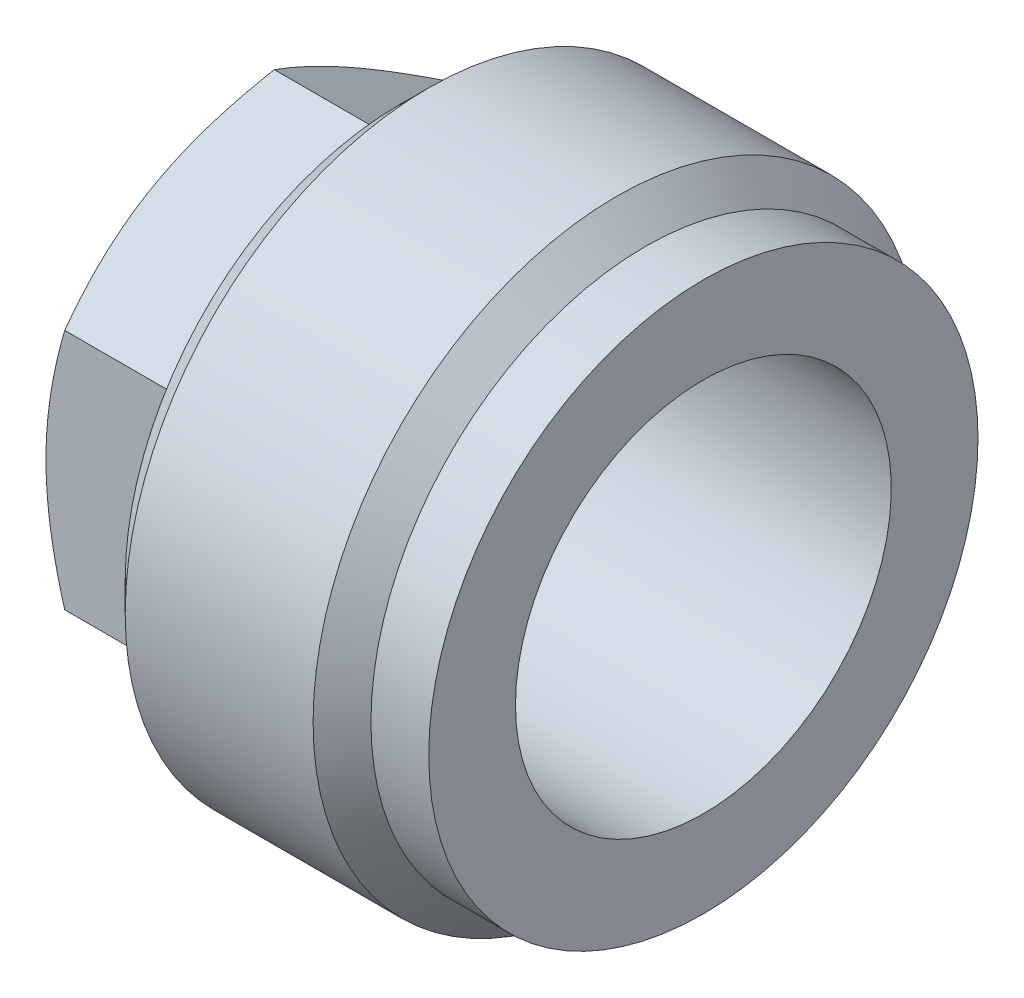
ISO-10303-21;
HEADER;
FILE_DESCRIPTION(('STEP AP214'),'2;1');
FILE_NAME('part.step','',(''),(''),'','','');
FILE_SCHEMA(('AUTOMOTIVE_DESIGN { 1 0 10303 214 1 1 1 1 }'));
ENDSEC;
DATA;
#1=APPLICATION_CONTEXT('core data for automotive mechanical design processes');
#2=APPLICATION_PROTOCOL_DEFINITION('international standard','automotive_design',2000,#1);
#3=PRODUCT_CONTEXT('',#1,'mechanical');
#4=PRODUCT('Part','Part','',(#3));
#5=PRODUCT_RELATED_PRODUCT_CATEGORY('part','',(#4));
#6=PRODUCT_DEFINITION_FORMATION('','',#4);
#7=PRODUCT_DEFINITION_CONTEXT('part definition',#1,'design');
#8=PRODUCT_DEFINITION('design','',#6,#7);
#9=PRODUCT_DEFINITION_SHAPE('','',#8);
#10=(LENGTH_UNIT() NAMED_UNIT(*) SI_UNIT(.MILLI.,.METRE.));
#11=(NAMED_UNIT(*) PLANE_ANGLE_UNIT() SI_UNIT($,.RADIAN.));
#12=(NAMED_UNIT(*) SI_UNIT($,.STERADIAN.) SOLID_ANGLE_UNIT());
#13=UNCERTAINTY_MEASURE_WITH_UNIT(LENGTH_MEASURE(1.E-05),#10,'distance_accuracy_value','');
#14=(GEOMETRIC_REPRESENTATION_CONTEXT(3) GLOBAL_UNCERTAINTY_ASSIGNED_CONTEXT((#13)) GLOBAL_UNIT_ASSIGNED_CONTEXT((#10,
#11,#12)) REPRESENTATION_CONTEXT('',''));
#15=CARTESIAN_POINT('',(0.,0.,0.));
#16=DIRECTION('',(0.,0.,1.));
#17=DIRECTION('',(1.,0.,0.));
#18=AXIS2_PLACEMENT_3D('',#15,#16,#17);
#19=CARTESIAN_POINT('',(0.,0.,0.));
#20=DIRECTION('',(1.,0.,0.));
#21=DIRECTION('',(0.,0.,-1.));
#22=AXIS2_PLACEMENT_3D('',#19,#20,#21);
#23=CONICAL_SURFACE('',#22,11.,1.0471975511966);
#24=CARTESIAN_POINT('',(0.,0.,0.));
#25=DIRECTION('',(-1.,0.,0.));
#26=DIRECTION('',(0.,0.,1.));
#27=AXIS2_PLACEMENT_3D('',#24,#25,#26);
#28=CIRCLE('',#27,11.);
#29=CARTESIAN_POINT('',(0.,0.,11.));
#30=VERTEX_POINT('',#29);
#31=EDGE_CURVE('E154',#30,#30,#28,.T.);
#32=ORIENTED_EDGE('',*,*,#31,.F.);
#33=EDGE_LOOP('',(#32));
#34=FACE_BOUND('',#33,.T.);
#35=CARTESIAN_POINT('',(8.85369715088494,-21.9837447292834,14.5));
#36=CARTESIAN_POINT('',(8.70204605875602,-21.6690801795933,14.5));
#37=CARTESIAN_POINT('',(8.55119048299628,-21.3540324231774,14.5));
#38=CARTESIAN_POINT('',(8.25125165099913,-20.7230903107022,14.5));
#39=CARTESIAN_POINT('',(8.10216841437291,-20.4071959453224,14.5));
#40=CARTESIAN_POINT('',(7.65780642841271,-19.4580311551152,14.5));
#41=CARTESIAN_POINT('',(7.36546439149564,-18.8233803892831,14.5));
#42=CARTESIAN_POINT('',(6.7887953399051,-17.5459566901159,14.5));
#43=CARTESIAN_POINT('',(6.50452533749712,-16.9031579542143,14.5));
#44=CARTESIAN_POINT('',(5.94831045484284,-15.6122677175618,14.5));
#45=CARTESIAN_POINT('',(5.67636495460579,-14.9641764849929,14.5));
#46=CARTESIAN_POINT('',(5.14049299184127,-13.6429681660332,14.5));
#47=CARTESIAN_POINT('',(4.87701981018571,-12.969666219259,14.5));
#48=CARTESIAN_POINT('',(4.37126035874995,-11.614997053229,14.5));
#49=CARTESIAN_POINT('',(4.12897653384384,-10.933628913549,14.5));
#50=CARTESIAN_POINT('',(3.6723298206573,-9.56321324763013,14.5));
#51=CARTESIAN_POINT('',(3.45790577193684,-8.87418627538426,14.5));
#52=CARTESIAN_POINT('',(3.06417774424848,-7.48620007270868,14.5));
#53=CARTESIAN_POINT('',(2.8848621581599,-6.78724420709032,14.5));
#54=CARTESIAN_POINT('',(2.64941908092588,-5.73314426646876,14.5));
#55=CARTESIAN_POINT('',(2.57666197092174,-5.38168833373473,14.5));
#56=CARTESIAN_POINT('',(2.44324478792689,-4.67647591473801,14.5));
#57=CARTESIAN_POINT('',(2.38258443658456,-4.32271948160428,14.5));
#58=CARTESIAN_POINT('',(2.27446033353613,-3.61319111402284,14.5));
#59=CARTESIAN_POINT('',(2.22699637527553,-3.25741921121091,14.5));
#60=CARTESIAN_POINT('',(2.1462255803631,-2.54426038157059,14.5));
#61=CARTESIAN_POINT('',(2.11291874632254,-2.18687345444432,14.5));
#62=CARTESIAN_POINT('',(2.06151782603693,-1.47544495728037,14.5));
#63=CARTESIAN_POINT('',(2.043240643502,-1.12141669565865,14.5));
#64=CARTESIAN_POINT('',(2.02162880295409,-0.412906860774309,14.5));
#65=CARTESIAN_POINT('',(2.0182939128042,-0.0584252946396092,14.5));
#66=CARTESIAN_POINT('',(2.02664555712274,0.650367577323326,14.5));
#67=CARTESIAN_POINT('',(2.03833234577728,1.004678880169,14.5));
#68=CARTESIAN_POINT('',(2.07645298909111,1.71251353163224,14.5));
#69=CARTESIAN_POINT('',(2.10288766893028,2.066036835048,14.5));
#70=CARTESIAN_POINT('',(2.18510492148384,2.93138207762086,14.5));
#71=CARTESIAN_POINT('',(2.24875406224798,3.44246851329039,14.5));
#72=CARTESIAN_POINT('',(2.40328217915786,4.46051202165636,14.5));
#73=CARTESIAN_POINT('',(2.49416529743642,4.96746845414635,14.5));
#74=CARTESIAN_POINT('',(2.69992739077851,5.97688278490651,14.5));
#75=CARTESIAN_POINT('',(2.8148263641863,6.47933656779497,14.5));
#76=CARTESIAN_POINT('',(3.06514729389721,7.47904614892213,14.5));
#77=CARTESIAN_POINT('',(3.20056881048709,7.97630205828581,14.5));
#78=CARTESIAN_POINT('',(3.49185520948424,8.97648287054239,14.5));
#79=CARTESIAN_POINT('',(3.64810024974023,9.47929630380537,14.5));
#80=CARTESIAN_POINT('',(3.97564768679148,10.4799678031127,14.5));
#81=CARTESIAN_POINT('',(4.14695018250332,10.9778258365798,14.5));
#82=CARTESIAN_POINT('',(4.50198849081267,11.9688530975369,14.5));
#83=CARTESIAN_POINT('',(4.68571951678699,12.4620240476497,14.5));
#84=CARTESIAN_POINT('',(5.0635604800101,13.4443517353121,14.5));
#85=CARTESIAN_POINT('',(5.25767030727211,13.9335085153375,14.5));
#86=CARTESIAN_POINT('',(5.72034900769401,15.0699643747976,14.5));
#87=CARTESIAN_POINT('',(5.99225937766753,15.7159008867475,14.5));
#88=CARTESIAN_POINT('',(6.54818005280653,17.0025603545441,14.5));
#89=CARTESIAN_POINT('',(6.83219099844285,17.6432830322851,14.5));
#90=CARTESIAN_POINT('',(7.40992297902714,18.920473508036,14.5));
#91=CARTESIAN_POINT('',(7.70364587439248,19.5569404624185,14.5));
#92=CARTESIAN_POINT('',(8.29887627851228,20.8262011707074,14.5));
#93=CARTESIAN_POINT('',(8.60038364451664,21.4589949917109,14.5));
#94=CARTESIAN_POINT('',(9.21004884791101,22.7221296195771,14.5));
#95=CARTESIAN_POINT('',(9.51821290615491,23.3524674190409,14.5));
#96=CARTESIAN_POINT('',(10.1397846011221,24.6105518575379,14.5));
#97=CARTESIAN_POINT('',(10.453192257243,25.2382984869749,14.5));
#98=CARTESIAN_POINT('',(11.0843315876181,26.4915242956458,14.5));
#99=CARTESIAN_POINT('',(11.4020627752816,27.1170037201702,14.5));
#100=CARTESIAN_POINT('',(12.041187755865,28.3660894797944,14.5));
#101=CARTESIAN_POINT('',(12.3625815617134,28.9896958082726,14.5));
#102=CARTESIAN_POINT('',(13.2792445163674,30.7575455749468,14.5));
#103=CARTESIAN_POINT('',(13.8781859068375,31.8998848960828,14.5));
#104=CARTESIAN_POINT('',(15.0838911182563,34.180463380899,14.5));
#105=CARTESIAN_POINT('',(15.690655179214,35.3187024174003,14.5));
#106=CARTESIAN_POINT('',(16.9088417254602,37.5894379626514,14.5));
#107=CARTESIAN_POINT('',(17.520250919918,38.7219416062141,14.5));
#108=CARTESIAN_POINT('',(18.4408708831463,40.4187570296067,14.5));
#109=CARTESIAN_POINT('',(18.7483211735969,40.9840253389499,14.5));
#110=CARTESIAN_POINT('',(19.3642743233957,42.1139871893487,14.5));
#111=CARTESIAN_POINT('',(19.6727771812338,42.6786807312276,14.5));
#112=CARTESIAN_POINT('',(19.9817462970959,43.2431191182595,14.5));
#113=B_SPLINE_CURVE_WITH_KNOTS('',3,(#35,#36,#37,#38,#39,#40,#41,#42,#43,#44,#45,#46,#47,#48,
#49,#50,#51,#52,#53,#54,#55,#56,#57,#58,#59,#60,#61,#62,#63,#64,#65,#66,#67,#68,#69,#70,#71,#72,
#73,#74,#75,#76,#77,#78,#79,#80,#81,#82,#83,#84,#85,#86,#87,#88,#89,#90,#91,#92,#93,#94,#95,#96,
#97,#98,#99,#100,#101,#102,#103,#104,#105,#106,#107,#108,#109,#110,#111,#112),.UNSPECIFIED.,.F.,
.F.,(4,2,2,2,2,2,2,2,2,2,2,2,2,2,2,2,2,2,2,2,2,2,2,2,2,2,2,2,2,2,2,2,2,2,2,2,2,2,4),(0.,
1.04790369237559,2.09581896918192,4.19198721607569,6.30043998476489,8.40878656859536,
10.5775655470282,12.7465944346624,14.9107781767023,17.0742452107258,18.1507942557225,
19.2273185260036,20.3038259452064,21.3803335629698,22.4435239504337,23.5066978205804,
24.569889681232,25.633141035985,27.1773789435955,28.7218518403067,30.2676160022407,
31.8133470495226,33.3926528806091,34.971969087366,36.5506804745136,38.1293751349744,
40.2317128244983,42.334161927134,44.4370161343548,46.5398318071955,48.6447057963304,
50.7495875737661,52.8542343856394,54.9588886289201,58.8283427169832,62.6979158084008,
66.5589201658682,68.4893300408467,70.4197371474434),.UNSPECIFIED.);
#114=CARTESIAN_POINT('',(3.3158137055808,-8.37157890324959,14.5));
#115=VERTEX_POINT('',#114);
#116=CARTESIAN_POINT('',(3.3158137055808,8.37157890324958,14.5));
#117=VERTEX_POINT('',#116);
#118=EDGE_CURVE('E157',#115,#117,#113,.T.);
#119=ORIENTED_EDGE('',*,*,#118,.T.);
#120=CARTESIAN_POINT('',(3.31588037293711,8.37146343319575,14.5002));
#121=CARTESIAN_POINT('',(3.20965246927558,8.55546747944839,14.1814956430922));
#122=CARTESIAN_POINT('',(3.10824498134964,8.74018924037394,13.8615481679055));
#123=CARTESIAN_POINT('',(2.91641074841678,9.11111401384652,13.2190876144651));
#124=CARTESIAN_POINT('',(2.82598761494956,9.29731749224125,12.8965737293393));
#125=CARTESIAN_POINT('',(2.65733756284704,9.67156556109036,12.2483570594581));
#126=CARTESIAN_POINT('',(2.57913950076179,9.85961342647729,11.9226486023531));
#127=CARTESIAN_POINT('',(2.43661873257904,10.2370158634131,11.26896840668));
#128=CARTESIAN_POINT('',(2.37229523490865,10.4263703597795,10.9409967983317));
#129=CARTESIAN_POINT('',(2.2602594955058,10.8015340722416,10.2911941871912));
#130=CARTESIAN_POINT('',(2.21217643566121,10.9873154357964,9.96941142641481));
#131=CARTESIAN_POINT('',(2.13155175339208,11.3597294504657,9.32437143155702));
#132=CARTESIAN_POINT('',(2.099010430111,11.546362117896,9.00111416921565));
#133=CARTESIAN_POINT('',(2.05029087069972,11.9199409708332,8.35405661529508));
#134=CARTESIAN_POINT('',(2.03409319014358,12.1068865181052,8.03025742917119));
#135=CARTESIAN_POINT('',(2.01840925926922,12.4809501828225,7.38236015661536));
#136=CARTESIAN_POINT('',(2.01892249258619,12.668068294757,7.05826207972854));
#137=CARTESIAN_POINT('',(2.03549312870936,13.0178844607384,6.45236270693979));
#138=CARTESIAN_POINT('',(2.04952931252634,13.180607443739,6.17051823282346));
#139=CARTESIAN_POINT('',(2.08997489243088,13.5056791091891,5.60747759216301));
#140=CARTESIAN_POINT('',(2.11638516371189,13.6680277643466,5.32628147288959));
#141=CARTESIAN_POINT('',(2.18111843864144,13.9922625918472,4.76469027807526));
#142=CARTESIAN_POINT('',(2.21945128117973,14.1541482703664,4.48429605786223));
#143=CARTESIAN_POINT('',(2.30735715707971,14.477160677042,3.92482215802512));
#144=CARTESIAN_POINT('',(2.35693095457372,14.6382873528427,3.64574256908353));
#145=CARTESIAN_POINT('',(2.52376693841917,15.1273963273992,2.79858097471386));
#146=CARTESIAN_POINT('',(2.6576644054764,15.4539622471642,2.23295220966028));
#147=CARTESIAN_POINT('',(2.96155687700353,16.1022245928325,1.11012889032907));
#148=CARTESIAN_POINT('',(3.13148051136534,16.4239293186526,0.552919960173676));
#149=CARTESIAN_POINT('',(3.31588037293711,16.743273276553,-0.00020000000000039));
#150=B_SPLINE_CURVE_WITH_KNOTS('',3,(#120,#121,#122,#123,#124,#125,#126,#127,#128,#129,#130,
#131,#132,#133,#134,#135,#136,#137,#138,#139,#140,#141,#142,#143,#144,#145,#146,#147,#148,#149),
.UNSPECIFIED.,.F.,.F.,(4,2,2,2,2,2,2,2,2,2,2,2,2,2,4),(0.,1.1491292412427,2.29863528726014,
3.45081498778683,4.60292893665856,5.72660597685857,6.85030464444022,7.9726648386707,
9.09499035216778,10.0720003417185,11.0490794435848,12.0269670115884,13.0049210739102,
15.0038354445183,16.9988262362696),.UNSPECIFIED.);
#151=CARTESIAN_POINT('',(3.3158137055808,16.7431578064992,0.));
#152=VERTEX_POINT('',#151);
#153=EDGE_CURVE('E204',#117,#152,#150,.T.);
#154=ORIENTED_EDGE('',*,*,#153,.T.);
#155=CARTESIAN_POINT('',(3.31588037293711,16.743273276553,0.000199999999997968));
#156=CARTESIAN_POINT('',(3.20965246927559,16.5592692303004,-0.318504356907842));
#157=CARTESIAN_POINT('',(3.10824498134965,16.3745474693748,-0.63845183209447));
#158=CARTESIAN_POINT('',(2.91641074841679,16.0036226959022,-1.28091238553496));
#159=CARTESIAN_POINT('',(2.82598761494956,15.8174192175075,-1.60342627066068));
#160=CARTESIAN_POINT('',(2.65733756284705,15.4431711486584,-2.25164294054187));
#161=CARTESIAN_POINT('',(2.5791395007618,15.2551232832715,-2.57735139764692));
#162=CARTESIAN_POINT('',(2.43661873257904,14.8777208463357,-3.23103159332003));
#163=CARTESIAN_POINT('',(2.37229523490866,14.6883663499693,-3.55900320166828));
#164=CARTESIAN_POINT('',(2.26025949550581,14.3132026375071,-4.20880581280883));
#165=CARTESIAN_POINT('',(2.21217643566121,14.1274212739523,-4.5305885735852));
#166=CARTESIAN_POINT('',(2.13155175339209,13.7550072592831,-5.175628568443));
#167=CARTESIAN_POINT('',(2.099010430111,13.5683745918528,-5.49888583078436));
#168=CARTESIAN_POINT('',(2.05029087069972,13.1947957389156,-6.14594338470494));
#169=CARTESIAN_POINT('',(2.03409319014359,13.0078501916436,-6.46974257082883));
#170=CARTESIAN_POINT('',(2.01840925926922,12.6337865269262,-7.11763984338466));
#171=CARTESIAN_POINT('',(2.01892249258618,12.4466684149918,-7.44173792027148));
#172=CARTESIAN_POINT('',(2.03549312870935,12.0968522490104,-8.04763729306023));
#173=CARTESIAN_POINT('',(2.04952931252634,11.9341292660097,-8.32948176717656));
#174=CARTESIAN_POINT('',(2.08997489243089,11.6090576005597,-8.89252240783701));
#175=CARTESIAN_POINT('',(2.11638516371189,11.4467089454021,-9.17371852711043));
#176=CARTESIAN_POINT('',(2.18111843864144,11.1224741179015,-9.73530972192476));
#177=CARTESIAN_POINT('',(2.21945128117973,10.9605884393823,-10.0157039421378));
#178=CARTESIAN_POINT('',(2.30735715707971,10.6375760327068,-10.5751778419749));
#179=CARTESIAN_POINT('',(2.35693095457372,10.476449356906,-10.8542574309165));
#180=CARTESIAN_POINT('',(2.52376693841918,9.98734038234961,-11.7014190252862));
#181=CARTESIAN_POINT('',(2.6576644054764,9.66077446258452,-12.2670477903397));
#182=CARTESIAN_POINT('',(2.96155687700353,9.01251211691626,-13.3898711096709));
#183=CARTESIAN_POINT('',(3.13148051136535,8.69080739109618,-13.9470800398263));
#184=CARTESIAN_POINT('',(3.31588037293712,8.37146343319575,-14.5002));
#185=B_SPLINE_CURVE_WITH_KNOTS('',3,(#155,#156,#157,#158,#159,#160,#161,#162,#163,#164,#165,
#166,#167,#168,#169,#170,#171,#172,#173,#174,#175,#176,#177,#178,#179,#180,#181,#182,#183,#184),
.UNSPECIFIED.,.F.,.F.,(4,2,2,2,2,2,2,2,2,2,2,2,2,2,4),(0.,1.1491292412427,2.29863528726014,
3.45081498778683,4.60292893665856,5.72660597685857,6.85030464444022,7.9726648386707,
9.09499035216778,10.0720003417185,11.0490794435847,12.0269670115884,13.0049210739102,
15.0038354445183,16.9988262362696),.UNSPECIFIED.);
#186=CARTESIAN_POINT('',(3.3158137055808,8.37157890324959,-14.5));
#187=VERTEX_POINT('',#186);
#188=EDGE_CURVE('E72',#152,#187,#185,.T.);
#189=ORIENTED_EDGE('',*,*,#188,.T.);
#190=CARTESIAN_POINT('',(8.85369715088494,-21.9837447292834,-14.5));
#191=CARTESIAN_POINT('',(8.70204605875601,-21.6690801795933,-14.5));
#192=CARTESIAN_POINT('',(8.55119048299627,-21.3540324231774,-14.5));
#193=CARTESIAN_POINT('',(8.25125165099912,-20.7230903107022,-14.5));
#194=CARTESIAN_POINT('',(8.10216841437291,-20.4071959453224,-14.5));
#195=CARTESIAN_POINT('',(7.65780642841271,-19.4580311551152,-14.5));
#196=CARTESIAN_POINT('',(7.36546439149563,-18.8233803892831,-14.5));
#197=CARTESIAN_POINT('',(6.78879533990509,-17.5459566901159,-14.5));
#198=CARTESIAN_POINT('',(6.50452533749712,-16.9031579542143,-14.5));
#199=CARTESIAN_POINT('',(5.94831045484284,-15.6122677175618,-14.5));
#200=CARTESIAN_POINT('',(5.67636495460579,-14.9641764849929,-14.5));
#201=CARTESIAN_POINT('',(5.14049299184126,-13.6429681660332,-14.5));
#202=CARTESIAN_POINT('',(4.87701981018571,-12.969666219259,-14.5));
#203=CARTESIAN_POINT('',(4.37126035874995,-11.614997053229,-14.5));
#204=CARTESIAN_POINT('',(4.12897653384384,-10.933628913549,-14.5));
#205=CARTESIAN_POINT('',(3.67232982065729,-9.56321324763011,-14.5));
#206=CARTESIAN_POINT('',(3.45790577193684,-8.87418627538425,-14.5));
#207=CARTESIAN_POINT('',(3.06417774424848,-7.48620007270867,-14.5));
#208=CARTESIAN_POINT('',(2.88486215815991,-6.78724420709031,-14.5));
#209=CARTESIAN_POINT('',(2.64941908092588,-5.73314426646875,-14.5));
#210=CARTESIAN_POINT('',(2.57666197092174,-5.38168833373472,-14.5));
#211=CARTESIAN_POINT('',(2.44324478792689,-4.676475914738,-14.5));
#212=CARTESIAN_POINT('',(2.38258443658456,-4.32271948160427,-14.5));
#213=CARTESIAN_POINT('',(2.27446033353613,-3.61319111402283,-14.5));
#214=CARTESIAN_POINT('',(2.22699637527553,-3.2574192112109,-14.5));
#215=CARTESIAN_POINT('',(2.1462255803631,-2.54426038157058,-14.5));
#216=CARTESIAN_POINT('',(2.11291874632255,-2.1868734544443,-14.5));
#217=CARTESIAN_POINT('',(2.06151782603693,-1.47544495728036,-14.5));
#218=CARTESIAN_POINT('',(2.043240643502,-1.12141669565864,-14.5));
#219=CARTESIAN_POINT('',(2.02162880295409,-0.412906860774294,-14.5));
#220=CARTESIAN_POINT('',(2.0182939128042,-0.0584252946395943,-14.5));
#221=CARTESIAN_POINT('',(2.02664555712275,0.65036757732334,-14.5));
#222=CARTESIAN_POINT('',(2.03833234577728,1.00467888016901,-14.5));
#223=CARTESIAN_POINT('',(2.07645298909111,1.71251353163225,-14.5));
#224=CARTESIAN_POINT('',(2.10288766893028,2.06603683504801,-14.5));
#225=CARTESIAN_POINT('',(2.18510492148384,2.93138207762088,-14.5));
#226=CARTESIAN_POINT('',(2.24875406224799,3.4424685132904,-14.5));
#227=CARTESIAN_POINT('',(2.40328217915787,4.46051202165637,-14.5));
#228=CARTESIAN_POINT('',(2.49416529743643,4.96746845414636,-14.5));
#229=CARTESIAN_POINT('',(2.69992739077851,5.97688278490652,-14.5));
#230=CARTESIAN_POINT('',(2.81482636418631,6.47933656779498,-14.5));
#231=CARTESIAN_POINT('',(3.06514729389722,7.47904614892214,-14.5));
#232=CARTESIAN_POINT('',(3.2005688104871,7.97630205828582,-14.5));
#233=CARTESIAN_POINT('',(3.49185520948425,8.97648287054241,-14.5));
#234=CARTESIAN_POINT('',(3.64810024974024,9.47929630380539,-14.5));
#235=CARTESIAN_POINT('',(3.97564768679149,10.4799678031128,-14.5));
#236=CARTESIAN_POINT('',(4.14695018250334,10.9778258365798,-14.5));
#237=CARTESIAN_POINT('',(4.50198849081268,11.9688530975369,-14.5));
#238=CARTESIAN_POINT('',(4.685719516787,12.4620240476497,-14.5));
#239=CARTESIAN_POINT('',(5.06356048001011,13.4443517353121,-14.5));
#240=CARTESIAN_POINT('',(5.25767030727212,13.9335085153375,-14.5));
#241=CARTESIAN_POINT('',(5.72034900769403,15.0699643747977,-14.5));
#242=CARTESIAN_POINT('',(5.99225937766755,15.7159008867475,-14.5));
#243=CARTESIAN_POINT('',(6.54818005280655,17.0025603545441,-14.5));
#244=CARTESIAN_POINT('',(6.83219099844287,17.6432830322851,-14.5));
#245=CARTESIAN_POINT('',(7.40992297902716,18.9204735080361,-14.5));
#246=CARTESIAN_POINT('',(7.70364587439249,19.5569404624185,-14.5));
#247=CARTESIAN_POINT('',(8.2988762785123,20.8262011707075,-14.5));
#248=CARTESIAN_POINT('',(8.60038364451666,21.4589949917109,-14.5));
#249=CARTESIAN_POINT('',(9.21004884791103,22.7221296195772,-14.5));
#250=CARTESIAN_POINT('',(9.51821290615493,23.3524674190409,-14.5));
#251=CARTESIAN_POINT('',(10.1397846011221,24.6105518575379,-14.5));
#252=CARTESIAN_POINT('',(10.453192257243,25.2382984869749,-14.5));
#253=CARTESIAN_POINT('',(11.0843315876181,26.4915242956458,-14.5));
#254=CARTESIAN_POINT('',(11.4020627752816,27.1170037201702,-14.5));
#255=CARTESIAN_POINT('',(12.041187755865,28.3660894797944,-14.5));
#256=CARTESIAN_POINT('',(12.3625815617134,28.9896958082726,-14.5));
#257=CARTESIAN_POINT('',(13.2792445163674,30.7575455749468,-14.5));
#258=CARTESIAN_POINT('',(13.8781859068375,31.8998848960828,-14.5));
#259=CARTESIAN_POINT('',(15.0838911182563,34.1804633808991,-14.5));
#260=CARTESIAN_POINT('',(15.690655179214,35.3187024174004,-14.5));
#261=CARTESIAN_POINT('',(16.9088417254603,37.5894379626515,-14.5));
#262=CARTESIAN_POINT('',(17.520250919918,38.7219416062142,-14.5));
#263=CARTESIAN_POINT('',(18.4408708831463,40.4187570296068,-14.5));
#264=CARTESIAN_POINT('',(18.7483211735969,40.9840253389499,-14.5));
#265=CARTESIAN_POINT('',(19.3642743233957,42.1139871893487,-14.5));
#266=CARTESIAN_POINT('',(19.6727771812338,42.6786807312276,-14.5));
#267=CARTESIAN_POINT('',(19.9817462970959,43.2431191182595,-14.5));
#268=B_SPLINE_CURVE_WITH_KNOTS('',3,(#190,#191,#192,#193,#194,#195,#196,#197,#198,#199,#200,
#201,#202,#203,#204,#205,#206,#207,#208,#209,#210,#211,#212,#213,#214,#215,#216,#217,#218,#219,
#220,#221,#222,#223,#224,#225,#226,#227,#228,#229,#230,#231,#232,#233,#234,#235,#236,#237,#238,
#239,#240,#241,#242,#243,#244,#245,#246,#247,#248,#249,#250,#251,#252,#253,#254,#255,#256,#257,
#258,#259,#260,#261,#262,#263,#264,#265,#266,#267),.UNSPECIFIED.,.F.,.F.,(4,2,2,2,2,2,2,2,2,2,2,
2,2,2,2,2,2,2,2,2,2,2,2,2,2,2,2,2,2,2,2,2,2,2,2,2,2,2,4),(0.,1.04790369237559,2.09581896918192,
4.19198721607568,6.30043998476488,8.40878656859535,10.5775655470282,12.7465944346624,
14.9107781767023,17.0742452107258,18.1507942557225,19.2273185260036,20.3038259452064,
21.3803335629698,22.4435239504337,23.5066978205804,24.569889681232,25.633141035985,
27.1773789435955,28.7218518403067,30.2676160022407,31.8133470495226,33.3926528806091,
34.971969087366,36.5506804745136,38.1293751349744,40.2317128244983,42.334161927134,
44.4370161343549,46.5398318071956,48.6447057963305,50.7495875737661,52.8542343856394,
54.9588886289201,58.8283427169832,62.6979158084008,66.5589201658683,68.4893300408467,
70.4197371474434),.UNSPECIFIED.);
#269=CARTESIAN_POINT('',(3.3158137055808,-8.37157890324958,-14.5));
#270=VERTEX_POINT('',#269);
#271=EDGE_CURVE('E117',#187,#270,#268,.F.);
#272=ORIENTED_EDGE('',*,*,#271,.T.);
#273=CARTESIAN_POINT('',(3.31588037293712,-8.37146343319574,-14.5002));
#274=CARTESIAN_POINT('',(3.20965246927559,-8.55546747944839,-14.1814956430922));
#275=CARTESIAN_POINT('',(3.10824498134964,-8.74018924037393,-13.8615481679056));
#276=CARTESIAN_POINT('',(2.91641074841678,-9.11111401384652,-13.2190876144651));
#277=CARTESIAN_POINT('',(2.82598761494956,-9.29731749224124,-12.8965737293393));
#278=CARTESIAN_POINT('',(2.65733756284705,-9.67156556109035,-12.2483570594581));
#279=CARTESIAN_POINT('',(2.5791395007618,-9.85961342647729,-11.9226486023531));
#280=CARTESIAN_POINT('',(2.43661873257904,-10.2370158634131,-11.26896840668));
#281=CARTESIAN_POINT('',(2.37229523490865,-10.4263703597795,-10.9409967983317));
#282=CARTESIAN_POINT('',(2.26025949550581,-10.8015340722416,-10.2911941871912));
#283=CARTESIAN_POINT('',(2.21217643566121,-10.9873154357964,-9.96941142641482));
#284=CARTESIAN_POINT('',(2.13155175339209,-11.3597294504657,-9.32437143155702));
#285=CARTESIAN_POINT('',(2.099010430111,-11.546362117896,-9.00111416921566));
#286=CARTESIAN_POINT('',(2.05029087069972,-11.9199409708332,-8.35405661529509));
#287=CARTESIAN_POINT('',(2.03409319014359,-12.1068865181052,-8.0302574291712));
#288=CARTESIAN_POINT('',(2.01840925926922,-12.4809501828225,-7.38236015661537));
#289=CARTESIAN_POINT('',(2.01892249258618,-12.668068294757,-7.05826207972854));
#290=CARTESIAN_POINT('',(2.03549312870935,-13.0178844607384,-6.4523627069398));
#291=CARTESIAN_POINT('',(2.04952931252633,-13.180607443739,-6.17051823282346));
#292=CARTESIAN_POINT('',(2.08997489243088,-13.5056791091891,-5.60747759216301));
#293=CARTESIAN_POINT('',(2.11638516371189,-13.6680277643466,-5.32628147288959));
#294=CARTESIAN_POINT('',(2.18111843864144,-13.9922625918472,-4.76469027807526));
#295=CARTESIAN_POINT('',(2.21945128117973,-14.1541482703664,-4.48429605786224));
#296=CARTESIAN_POINT('',(2.30735715707971,-14.477160677042,-3.92482215802513));
#297=CARTESIAN_POINT('',(2.35693095457372,-14.6382873528427,-3.64574256908353));
#298=CARTESIAN_POINT('',(2.52376693841917,-15.1273963273992,-2.79858097471387));
#299=CARTESIAN_POINT('',(2.6576644054764,-15.4539622471642,-2.23295220966028));
#300=CARTESIAN_POINT('',(2.96155687700353,-16.1022245928325,-1.11012889032908));
#301=CARTESIAN_POINT('',(3.13148051136535,-16.4239293186526,-0.552919960173681));
#302=CARTESIAN_POINT('',(3.31588037293711,-16.743273276553,0.000199999999998351));
#303=B_SPLINE_CURVE_WITH_KNOTS('',3,(#273,#274,#275,#276,#277,#278,#279,#280,#281,#282,#283,
#284,#285,#286,#287,#288,#289,#290,#291,#292,#293,#294,#295,#296,#297,#298,#299,#300,#301,#302),
.UNSPECIFIED.,.F.,.F.,(4,2,2,2,2,2,2,2,2,2,2,2,2,2,4),(0.,1.1491292412427,2.29863528726014,
3.45081498778683,4.60292893665856,5.72660597685857,6.85030464444022,7.9726648386707,
9.09499035216778,10.0720003417185,11.0490794435848,12.0269670115884,13.0049210739102,
15.0038354445184,16.9988262362696),.UNSPECIFIED.);
#304=CARTESIAN_POINT('',(3.3158137055808,-16.7431578064992,0.));
#305=VERTEX_POINT('',#304);
#306=EDGE_CURVE('E190',#270,#305,#303,.T.);
#307=ORIENTED_EDGE('',*,*,#306,.T.);
#308=CARTESIAN_POINT('',(3.31588037293711,-16.743273276553,-0.000200000000002602));
#309=CARTESIAN_POINT('',(3.20965246927559,-16.5592692303004,0.318504356907838));
#310=CARTESIAN_POINT('',(3.10824498134965,-16.3745474693748,0.638451832094467));
#311=CARTESIAN_POINT('',(2.91641074841679,-16.0036226959022,1.28091238553496));
#312=CARTESIAN_POINT('',(2.82598761494956,-15.8174192175075,1.60342627066068));
#313=CARTESIAN_POINT('',(2.65733756284705,-15.4431711486584,2.25164294054187));
#314=CARTESIAN_POINT('',(2.5791395007618,-15.2551232832715,2.57735139764691));
#315=CARTESIAN_POINT('',(2.43661873257904,-14.8777208463357,3.23103159332003));
#316=CARTESIAN_POINT('',(2.37229523490866,-14.6883663499693,3.55900320166827));
#317=CARTESIAN_POINT('',(2.26025949550581,-14.3132026375071,4.20880581280882));
#318=CARTESIAN_POINT('',(2.21217643566121,-14.1274212739523,4.5305885735852));
#319=CARTESIAN_POINT('',(2.13155175339209,-13.7550072592831,5.175628568443));
#320=CARTESIAN_POINT('',(2.099010430111,-13.5683745918528,5.49888583078436));
#321=CARTESIAN_POINT('',(2.05029087069972,-13.1947957389156,6.14594338470493));
#322=CARTESIAN_POINT('',(2.03409319014359,-13.0078501916436,6.46974257082882));
#323=CARTESIAN_POINT('',(2.01840925926922,-12.6337865269262,7.11763984338466));
#324=CARTESIAN_POINT('',(2.01892249258618,-12.4466684149918,7.44173792027148));
#325=CARTESIAN_POINT('',(2.03549312870935,-12.0968522490104,8.04763729306022));
#326=CARTESIAN_POINT('',(2.04952931252634,-11.9341292660097,8.32948176717655));
#327=CARTESIAN_POINT('',(2.08997489243089,-11.6090576005597,8.89252240783701));
#328=CARTESIAN_POINT('',(2.11638516371189,-11.4467089454021,9.17371852711043));
#329=CARTESIAN_POINT('',(2.18111843864144,-11.1224741179015,9.73530972192476));
#330=CARTESIAN_POINT('',(2.21945128117973,-10.9605884393823,10.0157039421378));
#331=CARTESIAN_POINT('',(2.30735715707971,-10.6375760327068,10.5751778419749));
#332=CARTESIAN_POINT('',(2.35693095457372,-10.476449356906,10.8542574309165));
#333=CARTESIAN_POINT('',(2.52376693841918,-9.98734038234961,11.7014190252862));
#334=CARTESIAN_POINT('',(2.6576644054764,-9.66077446258453,12.2670477903397));
#335=CARTESIAN_POINT('',(2.96155687700353,-9.01251211691626,13.3898711096709));
#336=CARTESIAN_POINT('',(3.13148051136535,-8.69080739109618,13.9470800398263));
#337=CARTESIAN_POINT('',(3.31588037293712,-8.37146343319576,14.5002));
#338=B_SPLINE_CURVE_WITH_KNOTS('',3,(#308,#309,#310,#311,#312,#313,#314,#315,#316,#317,#318,
#319,#320,#321,#322,#323,#324,#325,#326,#327,#328,#329,#330,#331,#332,#333,#334,#335,#336,#337),
.UNSPECIFIED.,.F.,.F.,(4,2,2,2,2,2,2,2,2,2,2,2,2,2,4),(0.,1.1491292412427,2.29863528726014,
3.45081498778683,4.60292893665856,5.72660597685857,6.85030464444022,7.97266483867069,
9.09499035216778,10.0720003417185,11.0490794435847,12.0269670115884,13.0049210739102,
15.0038354445183,16.9988262362696),.UNSPECIFIED.);
#339=EDGE_CURVE('E165',#305,#115,#338,.T.);
#340=ORIENTED_EDGE('',*,*,#339,.T.);
#341=EDGE_LOOP('',(#119,#154,#189,#272,#307,#340));
#342=FACE_BOUND('',#341,.T.);
#343=ADVANCED_FACE('F49',(#34,#342),#23,.T.);
#344=CARTESIAN_POINT('',(0.,0.,0.));
#345=DIRECTION('',(-1.,0.,0.));
#346=DIRECTION('',(0.,0.,1.));
#347=AXIS2_PLACEMENT_3D('',#344,#345,#346);
#348=CYLINDRICAL_SURFACE('',#347,9.188);
#349=CARTESIAN_POINT('',(1.60000000000001,0.,0.));
#350=DIRECTION('',(-1.,0.,0.));
#351=DIRECTION('',(0.,0.,1.));
#352=AXIS2_PLACEMENT_3D('',#349,#350,#351);
#353=CIRCLE('',#352,9.188);
#354=CARTESIAN_POINT('',(1.60000000000001,0.,9.18800000000001));
#355=VERTEX_POINT('',#354);
#356=EDGE_CURVE('E57',#355,#355,#353,.T.);
#357=ORIENTED_EDGE('',*,*,#356,.T.);
#358=EDGE_LOOP('',(#357));
#359=FACE_BOUND('',#358,.T.);
#360=CARTESIAN_POINT('',(13.,0.,0.));
#361=DIRECTION('',(-1.,0.,0.));
#362=DIRECTION('',(0.,0.,1.));
#363=AXIS2_PLACEMENT_3D('',#360,#361,#362);
#364=CIRCLE('',#363,9.188);
#365=CARTESIAN_POINT('',(13.,0.,9.18800000000001));
#366=VERTEX_POINT('',#365);
#367=EDGE_CURVE('E136',#366,#366,#364,.T.);
#368=ORIENTED_EDGE('',*,*,#367,.F.);
#369=EDGE_LOOP('',(#368));
#370=FACE_BOUND('',#369,.T.);
#371=ADVANCED_FACE('F246',(#359,#370),#348,.F.);
#372=CARTESIAN_POINT('',(0.,-9.18800000000001,0.));
#373=DIRECTION('',(-1.,0.,0.));
#374=DIRECTION('',(0.,0.,1.));
#375=AXIS2_PLACEMENT_3D('',#372,#373,#374);
#376=PLANE('',#375);
#377=CARTESIAN_POINT('',(0.,0.,0.));
#378=DIRECTION('',(-1.,0.,0.));
#379=DIRECTION('',(0.,0.,1.));
#380=AXIS2_PLACEMENT_3D('',#377,#378,#379);
#381=CIRCLE('',#380,10.788);
#382=CARTESIAN_POINT('',(0.,0.,10.788));
#383=VERTEX_POINT('',#382);
#384=EDGE_CURVE('E13',#383,#383,#381,.F.);
#385=ORIENTED_EDGE('',*,*,#384,.T.);
#386=EDGE_LOOP('',(#385));
#387=FACE_BOUND('',#386,.T.);
#388=ORIENTED_EDGE('',*,*,#31,.T.);
#389=EDGE_LOOP('',(#388));
#390=FACE_BOUND('',#389,.T.);
#391=ADVANCED_FACE('F241',(#387,#390),#376,.T.);
#392=CARTESIAN_POINT('',(12.,-17.5,0.));
#393=DIRECTION('',(-1.,0.,0.));
#394=DIRECTION('',(0.,0.,1.));
#395=AXIS2_PLACEMENT_3D('',#392,#393,#394);
#396=PLANE('',#395);
#397=CARTESIAN_POINT('',(12.,0.,0.));
#398=DIRECTION('',(-1.,0.,0.));
#399=DIRECTION('',(0.,0.,1.));
#400=AXIS2_PLACEMENT_3D('',#397,#398,#399);
#401=CIRCLE('',#400,19.);
#402=CARTESIAN_POINT('',(12.,0.,19.));
#403=VERTEX_POINT('',#402);
#404=EDGE_CURVE('E269',#403,#403,#401,.T.);
#405=ORIENTED_EDGE('',*,*,#404,.T.);
#406=EDGE_LOOP('',(#405));
#407=FACE_BOUND('',#406,.T.);
#408=DIRECTION('',(0.,0.5,0.86602540378444));
#409=VECTOR('',#408,1.);
#410=CARTESIAN_POINT('',(12.,12.5573683548744,-7.25000000000001));
#411=LINE('',#410,#409);
#412=CARTESIAN_POINT('',(12.,8.37157890324959,-14.5));
#413=VERTEX_POINT('',#412);
#414=CARTESIAN_POINT('',(12.,16.7431578064992,0.));
#415=VERTEX_POINT('',#414);
#416=EDGE_CURVE('E102',#413,#415,#411,.T.);
#417=ORIENTED_EDGE('',*,*,#416,.T.);
#418=DIRECTION('',(0.,-0.500000000000001,0.86602540378444));
#419=VECTOR('',#418,1.);
#420=CARTESIAN_POINT('',(12.,12.5573683548744,7.25000000000001));
#421=LINE('',#420,#419);
#422=CARTESIAN_POINT('',(12.,8.37157890324958,14.5));
#423=VERTEX_POINT('',#422);
#424=EDGE_CURVE('E268',#415,#423,#421,.T.);
#425=ORIENTED_EDGE('',*,*,#424,.T.);
#426=DIRECTION('',(0.,-1.,0.));
#427=VECTOR('',#426,1.);
#428=CARTESIAN_POINT('',(12.,0.,14.5));
#429=LINE('',#428,#427);
#430=CARTESIAN_POINT('',(12.,-8.37157890324959,14.5));
#431=VERTEX_POINT('',#430);
#432=EDGE_CURVE('E132',#423,#431,#429,.T.);
#433=ORIENTED_EDGE('',*,*,#432,.T.);
#434=DIRECTION('',(0.,-0.5,-0.86602540378444));
#435=VECTOR('',#434,1.);
#436=CARTESIAN_POINT('',(12.,-12.5573683548744,7.25000000000001));
#437=LINE('',#436,#435);
#438=CARTESIAN_POINT('',(12.,-16.7431578064992,0.));
#439=VERTEX_POINT('',#438);
#440=EDGE_CURVE('E129',#431,#439,#437,.T.);
#441=ORIENTED_EDGE('',*,*,#440,.T.);
#442=DIRECTION('',(0.,0.500000000000001,-0.866025403784439));
#443=VECTOR('',#442,1.);
#444=CARTESIAN_POINT('',(12.,-12.5573683548744,-7.25000000000001));
#445=LINE('',#444,#443);
#446=CARTESIAN_POINT('',(12.,-8.37157890324958,-14.5));
#447=VERTEX_POINT('',#446);
#448=EDGE_CURVE('E118',#439,#447,#445,.T.);
#449=ORIENTED_EDGE('',*,*,#448,.T.);
#450=DIRECTION('',(0.,1.,0.));
#451=VECTOR('',#450,1.);
#452=CARTESIAN_POINT('',(12.,0.,-14.5));
#453=LINE('',#452,#451);
#454=EDGE_CURVE('E114',#447,#413,#453,.T.);
#455=ORIENTED_EDGE('',*,*,#454,.T.);
#456=EDGE_LOOP('',(#417,#425,#433,#441,#449,#455));
#457=FACE_BOUND('',#456,.T.);
#458=ADVANCED_FACE('F121',(#407,#457),#396,.T.);
#459=CARTESIAN_POINT('',(0.,0.,0.));
#460=DIRECTION('',(-1.,0.,0.));
#461=DIRECTION('',(0.,0.,1.));
#462=AXIS2_PLACEMENT_3D('',#459,#460,#461);
#463=CYLINDRICAL_SURFACE('',#462,21.);
#464=CARTESIAN_POINT('',(14.,0.,0.));
#465=DIRECTION('',(-1.,0.,0.));
#466=DIRECTION('',(0.,0.,1.));
#467=AXIS2_PLACEMENT_3D('',#464,#465,#466);
#468=CIRCLE('',#467,21.);
#469=CARTESIAN_POINT('',(14.,0.,21.));
#470=VERTEX_POINT('',#469);
#471=EDGE_CURVE('E270',#470,#470,#468,.F.);
#472=ORIENTED_EDGE('',*,*,#471,.T.);
#473=EDGE_LOOP('',(#472));
#474=FACE_BOUND('',#473,.T.);
#475=CARTESIAN_POINT('',(27.,0.,0.));
#476=DIRECTION('',(-1.,0.,0.));
#477=DIRECTION('',(0.,0.,1.));
#478=AXIS2_PLACEMENT_3D('',#475,#476,#477);
#479=CIRCLE('',#478,21.);
#480=CARTESIAN_POINT('',(27.,0.,21.));
#481=VERTEX_POINT('',#480);
#482=EDGE_CURVE('E151',#481,#481,#479,.T.);
#483=ORIENTED_EDGE('',*,*,#482,.T.);
#484=EDGE_LOOP('',(#483));
#485=FACE_BOUND('',#484,.T.);
#486=ADVANCED_FACE('F236',(#474,#485),#463,.T.);
#487=CARTESIAN_POINT('',(27.,0.,0.));
#488=DIRECTION('',(-1.,0.,0.));
#489=DIRECTION('',(0.,0.,1.));
#490=AXIS2_PLACEMENT_3D('',#487,#488,#489);
#491=CONICAL_SURFACE('',#490,21.,0.78539816339745);
#492=CARTESIAN_POINT('',(29.,0.,0.));
#493=DIRECTION('',(-1.,0.,0.));
#494=DIRECTION('',(0.,0.,1.));
#495=AXIS2_PLACEMENT_3D('',#492,#493,#494);
#496=CIRCLE('',#495,19.);
#497=CARTESIAN_POINT('',(29.,0.,19.));
#498=VERTEX_POINT('',#497);
#499=EDGE_CURVE('E148',#498,#498,#496,.T.);
#500=ORIENTED_EDGE('',*,*,#499,.T.);
#501=EDGE_LOOP('',(#500));
#502=FACE_BOUND('',#501,.T.);
#503=ORIENTED_EDGE('',*,*,#482,.F.);
#504=EDGE_LOOP('',(#503));
#505=FACE_BOUND('',#504,.T.);
#506=ADVANCED_FACE('F232',(#502,#505),#491,.T.);
#507=CARTESIAN_POINT('',(0.,0.,0.));
#508=DIRECTION('',(-1.,0.,0.));
#509=DIRECTION('',(0.,0.,1.));
#510=AXIS2_PLACEMENT_3D('',#507,#508,#509);
#511=CYLINDRICAL_SURFACE('',#510,19.);
#512=CARTESIAN_POINT('',(33.,0.,0.));
#513=DIRECTION('',(-1.,0.,0.));
#514=DIRECTION('',(0.,0.,1.));
#515=AXIS2_PLACEMENT_3D('',#512,#513,#514);
#516=CIRCLE('',#515,19.);
#517=CARTESIAN_POINT('',(33.,0.,19.));
#518=VERTEX_POINT('',#517);
#519=EDGE_CURVE('E145',#518,#518,#516,.T.);
#520=ORIENTED_EDGE('',*,*,#519,.T.);
#521=EDGE_LOOP('',(#520));
#522=FACE_BOUND('',#521,.T.);
#523=ORIENTED_EDGE('',*,*,#499,.F.);
#524=EDGE_LOOP('',(#523));
#525=FACE_BOUND('',#524,.T.);
#526=ADVANCED_FACE('F228',(#522,#525),#511,.T.);
#527=CARTESIAN_POINT('',(33.,-19.,0.));
#528=DIRECTION('',(1.,0.,0.));
#529=DIRECTION('',(0.,0.,-1.));
#530=AXIS2_PLACEMENT_3D('',#527,#528,#529);
#531=PLANE('',#530);
#532=CARTESIAN_POINT('',(33.,0.,0.));
#533=DIRECTION('',(-1.,0.,0.));
#534=DIRECTION('',(0.,0.,1.));
#535=AXIS2_PLACEMENT_3D('',#532,#533,#534);
#536=CIRCLE('',#535,13.);
#537=CARTESIAN_POINT('',(33.,0.,13.));
#538=VERTEX_POINT('',#537);
#539=EDGE_CURVE('E142',#538,#538,#536,.T.);
#540=ORIENTED_EDGE('',*,*,#539,.T.);
#541=EDGE_LOOP('',(#540));
#542=FACE_BOUND('',#541,.T.);
#543=ORIENTED_EDGE('',*,*,#519,.F.);
#544=EDGE_LOOP('',(#543));
#545=FACE_BOUND('',#544,.T.);
#546=ADVANCED_FACE('F224',(#542,#545),#531,.T.);
#547=CARTESIAN_POINT('',(0.,0.,0.));
#548=DIRECTION('',(-1.,0.,0.));
#549=DIRECTION('',(0.,0.,1.));
#550=AXIS2_PLACEMENT_3D('',#547,#548,#549);
#551=CYLINDRICAL_SURFACE('',#550,13.);
#552=CARTESIAN_POINT('',(13.,0.,0.));
#553=DIRECTION('',(-1.,0.,0.));
#554=DIRECTION('',(0.,0.,1.));
#555=AXIS2_PLACEMENT_3D('',#552,#553,#554);
#556=CIRCLE('',#555,13.);
#557=CARTESIAN_POINT('',(13.,0.,13.));
#558=VERTEX_POINT('',#557);
#559=EDGE_CURVE('E139',#558,#558,#556,.T.);
#560=ORIENTED_EDGE('',*,*,#559,.T.);
#561=EDGE_LOOP('',(#560));
#562=FACE_BOUND('',#561,.T.);
#563=ORIENTED_EDGE('',*,*,#539,.F.);
#564=EDGE_LOOP('',(#563));
#565=FACE_BOUND('',#564,.T.);
#566=ADVANCED_FACE('F220',(#562,#565),#551,.F.);
#567=CARTESIAN_POINT('',(13.,-13.,0.));
#568=DIRECTION('',(1.,0.,0.));
#569=DIRECTION('',(0.,0.,-1.));
#570=AXIS2_PLACEMENT_3D('',#567,#568,#569);
#571=PLANE('',#570);
#572=ORIENTED_EDGE('',*,*,#367,.T.);
#573=EDGE_LOOP('',(#572));
#574=FACE_BOUND('',#573,.T.);
#575=ORIENTED_EDGE('',*,*,#559,.F.);
#576=EDGE_LOOP('',(#575));
#577=FACE_BOUND('',#576,.T.);
#578=ADVANCED_FACE('F216',(#574,#577),#571,.T.);
#579=CARTESIAN_POINT('',(61.4974746830583,12.5573683548744,7.25000000000001));
#580=DIRECTION('',(0.,0.866025403784439,0.5));
#581=DIRECTION('',(0.,-0.500000000000001,0.86602540378444));
#582=AXIS2_PLACEMENT_3D('',#579,#580,#581);
#583=PLANE('',#582);
#584=DIRECTION('',(-1.,0.,0.));
#585=VECTOR('',#584,1.);
#586=CARTESIAN_POINT('',(61.4974746830583,8.37157890324958,14.5));
#587=LINE('',#586,#585);
#588=EDGE_CURVE('E64',#423,#117,#587,.T.);
#589=ORIENTED_EDGE('',*,*,#588,.F.);
#590=ORIENTED_EDGE('',*,*,#424,.F.);
#591=DIRECTION('',(-1.,0.,0.));
#592=VECTOR('',#591,1.);
#593=CARTESIAN_POINT('',(61.4974746830583,16.7431578064992,0.));
#594=LINE('',#593,#592);
#595=EDGE_CURVE('E106',#415,#152,#594,.T.);
#596=ORIENTED_EDGE('',*,*,#595,.T.);
#597=ORIENTED_EDGE('',*,*,#153,.F.);
#598=EDGE_LOOP('',(#589,#590,#596,#597));
#599=FACE_BOUND('',#598,.T.);
#600=ADVANCED_FACE('F212',(#599),#583,.T.);
#601=CARTESIAN_POINT('',(61.4974746830583,12.5573683548744,-7.25000000000001));
#602=DIRECTION('',(0.,0.86602540378444,-0.5));
#603=DIRECTION('',(0.,0.5,0.86602540378444));
#604=AXIS2_PLACEMENT_3D('',#601,#602,#603);
#605=PLANE('',#604);
#606=ORIENTED_EDGE('',*,*,#595,.F.);
#607=ORIENTED_EDGE('',*,*,#416,.F.);
#608=DIRECTION('',(-1.,0.,0.));
#609=VECTOR('',#608,1.);
#610=CARTESIAN_POINT('',(61.4974746830583,8.37157890324959,-14.5));
#611=LINE('',#610,#609);
#612=EDGE_CURVE('E105',#413,#187,#611,.T.);
#613=ORIENTED_EDGE('',*,*,#612,.T.);
#614=ORIENTED_EDGE('',*,*,#188,.F.);
#615=EDGE_LOOP('',(#606,#607,#613,#614));
#616=FACE_BOUND('',#615,.T.);
#617=ADVANCED_FACE('F104',(#616),#605,.T.);
#618=CARTESIAN_POINT('',(61.4974746830583,0.,-14.5));
#619=DIRECTION('',(0.,0.,-1.));
#620=DIRECTION('',(0.,1.,0.));
#621=AXIS2_PLACEMENT_3D('',#618,#619,#620);
#622=PLANE('',#621);
#623=ORIENTED_EDGE('',*,*,#612,.F.);
#624=ORIENTED_EDGE('',*,*,#454,.F.);
#625=DIRECTION('',(-1.,0.,0.));
#626=VECTOR('',#625,1.);
#627=CARTESIAN_POINT('',(61.4974746830583,-8.37157890324958,-14.5));
#628=LINE('',#627,#626);
#629=EDGE_CURVE('E128',#447,#270,#628,.T.);
#630=ORIENTED_EDGE('',*,*,#629,.T.);
#631=ORIENTED_EDGE('',*,*,#271,.F.);
#632=EDGE_LOOP('',(#623,#624,#630,#631));
#633=FACE_BOUND('',#632,.T.);
#634=ADVANCED_FACE('F112',(#633),#622,.T.);
#635=CARTESIAN_POINT('',(61.4974746830583,-12.5573683548744,-7.25000000000001));
#636=DIRECTION('',(0.,-0.866025403784439,-0.500000000000001));
#637=DIRECTION('',(0.,0.500000000000001,-0.866025403784439));
#638=AXIS2_PLACEMENT_3D('',#635,#636,#637);
#639=PLANE('',#638);
#640=ORIENTED_EDGE('',*,*,#629,.F.);
#641=ORIENTED_EDGE('',*,*,#448,.F.);
#642=DIRECTION('',(-1.,0.,0.));
#643=VECTOR('',#642,1.);
#644=CARTESIAN_POINT('',(61.4974746830583,-16.7431578064992,0.));
#645=LINE('',#644,#643);
#646=EDGE_CURVE('E131',#439,#305,#645,.T.);
#647=ORIENTED_EDGE('',*,*,#646,.T.);
#648=ORIENTED_EDGE('',*,*,#306,.F.);
#649=EDGE_LOOP('',(#640,#641,#647,#648));
#650=FACE_BOUND('',#649,.T.);
#651=ADVANCED_FACE('F182',(#650),#639,.T.);
#652=CARTESIAN_POINT('',(61.4974746830583,-12.5573683548744,7.25000000000001));
#653=DIRECTION('',(0.,-0.86602540378444,0.5));
#654=DIRECTION('',(0.,-0.5,-0.86602540378444));
#655=AXIS2_PLACEMENT_3D('',#652,#653,#654);
#656=PLANE('',#655);
#657=ORIENTED_EDGE('',*,*,#646,.F.);
#658=ORIENTED_EDGE('',*,*,#440,.F.);
#659=DIRECTION('',(-1.,0.,0.));
#660=VECTOR('',#659,1.);
#661=CARTESIAN_POINT('',(61.4974746830583,-8.37157890324959,14.5));
#662=LINE('',#661,#660);
#663=EDGE_CURVE('E135',#431,#115,#662,.T.);
#664=ORIENTED_EDGE('',*,*,#663,.T.);
#665=ORIENTED_EDGE('',*,*,#339,.F.);
#666=EDGE_LOOP('',(#657,#658,#664,#665));
#667=FACE_BOUND('',#666,.T.);
#668=ADVANCED_FACE('F178',(#667),#656,.T.);
#669=CARTESIAN_POINT('',(61.4974746830583,0.,14.5));
#670=DIRECTION('',(0.,0.,1.));
#671=DIRECTION('',(0.,-1.,0.));
#672=AXIS2_PLACEMENT_3D('',#669,#670,#671);
#673=PLANE('',#672);
#674=ORIENTED_EDGE('',*,*,#663,.F.);
#675=ORIENTED_EDGE('',*,*,#432,.F.);
#676=ORIENTED_EDGE('',*,*,#588,.T.);
#677=ORIENTED_EDGE('',*,*,#118,.F.);
#678=EDGE_LOOP('',(#674,#675,#676,#677));
#679=FACE_BOUND('',#678,.T.);
#680=ADVANCED_FACE('F174',(#679),#673,.T.);
#681=CARTESIAN_POINT('',(12.,0.,0.));
#682=DIRECTION('',(1.,0.,0.));
#683=DIRECTION('',(0.,0.,-1.));
#684=AXIS2_PLACEMENT_3D('',#681,#682,#683);
#685=CONICAL_SURFACE('',#684,19.,0.785398163397447);
#686=ORIENTED_EDGE('',*,*,#471,.F.);
#687=EDGE_LOOP('',(#686));
#688=FACE_BOUND('',#687,.T.);
#689=ORIENTED_EDGE('',*,*,#404,.F.);
#690=EDGE_LOOP('',(#689));
#691=FACE_BOUND('',#690,.T.);
#692=ADVANCED_FACE('F177',(#688,#691),#685,.T.);
#693=CARTESIAN_POINT('',(1.60000000000001,0.,0.));
#694=DIRECTION('',(-1.,0.,0.));
#695=DIRECTION('',(0.,0.,1.));
#696=AXIS2_PLACEMENT_3D('',#693,#694,#695);
#697=CONICAL_SURFACE('',#696,9.188,0.785398163397449);
#698=ORIENTED_EDGE('',*,*,#384,.F.);
#699=EDGE_LOOP('',(#698));
#700=FACE_BOUND('',#699,.T.);
#701=ORIENTED_EDGE('',*,*,#356,.F.);
#702=EDGE_LOOP('',(#701));
#703=FACE_BOUND('',#702,.T.);
#704=ADVANCED_FACE('F51',(#700,#703),#697,.F.);
#705=CLOSED_SHELL('',(#343,#371,#391,#458,#486,#506,#526,#546,#566,#578,#600,#617,#634,#651,
#668,#680,#692,#704));
#706=MANIFOLD_SOLID_BREP('B2',#705);
#707=ADVANCED_BREP_SHAPE_REPRESENTATION('',(#18,#706),#14);
#708=SHAPE_DEFINITION_REPRESENTATION(#9,#707);
ENDSEC;
END-ISO-10303-21;
